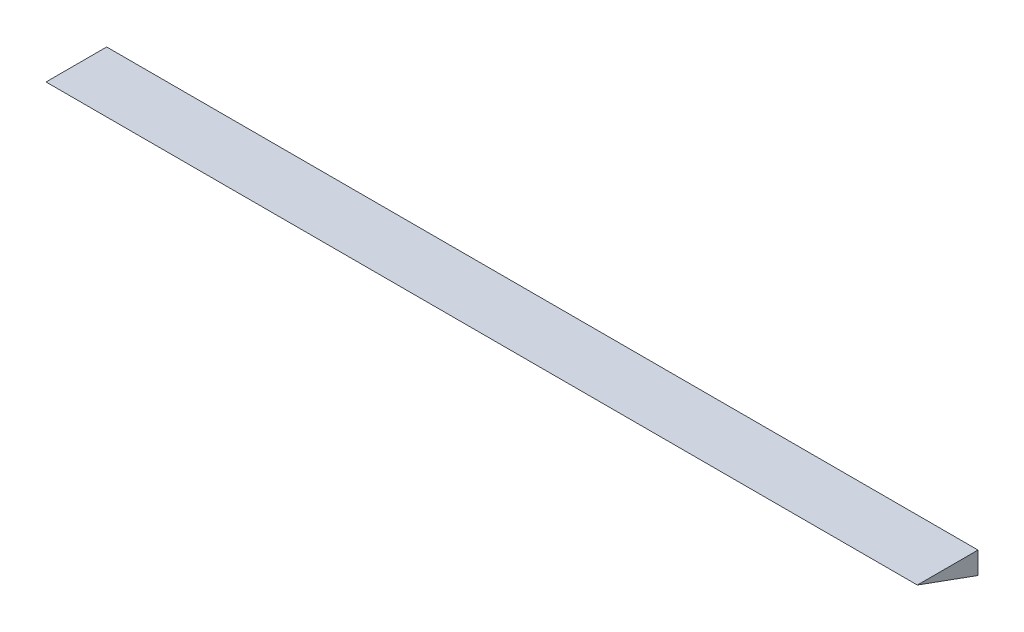
ISO-10303-21;
HEADER;
FILE_DESCRIPTION(('STEP AP214'),'2;1');
FILE_NAME('part.step','',(''),(''),'','','');
FILE_SCHEMA(('AUTOMOTIVE_DESIGN { 1 0 10303 214 1 1 1 1 }'));
ENDSEC;
DATA;
#1=APPLICATION_CONTEXT('core data for automotive mechanical design processes');
#2=APPLICATION_PROTOCOL_DEFINITION('international standard','automotive_design',2000,#1);
#3=PRODUCT_CONTEXT('',#1,'mechanical');
#4=PRODUCT('Part','Part','',(#3));
#5=PRODUCT_RELATED_PRODUCT_CATEGORY('part','',(#4));
#6=PRODUCT_DEFINITION_FORMATION('','',#4);
#7=PRODUCT_DEFINITION_CONTEXT('part definition',#1,'design');
#8=PRODUCT_DEFINITION('design','',#6,#7);
#9=PRODUCT_DEFINITION_SHAPE('','',#8);
#10=(LENGTH_UNIT() NAMED_UNIT(*) SI_UNIT(.MILLI.,.METRE.));
#11=(NAMED_UNIT(*) PLANE_ANGLE_UNIT() SI_UNIT($,.RADIAN.));
#12=(NAMED_UNIT(*) SI_UNIT($,.STERADIAN.) SOLID_ANGLE_UNIT());
#13=UNCERTAINTY_MEASURE_WITH_UNIT(LENGTH_MEASURE(1.E-05),#10,'distance_accuracy_value','');
#14=(GEOMETRIC_REPRESENTATION_CONTEXT(3) GLOBAL_UNCERTAINTY_ASSIGNED_CONTEXT((#13)) GLOBAL_UNIT_ASSIGNED_CONTEXT((#10,
#11,#12)) REPRESENTATION_CONTEXT('',''));
#15=CARTESIAN_POINT('',(0.,0.,0.));
#16=DIRECTION('',(0.,0.,1.));
#17=DIRECTION('',(1.,0.,0.));
#18=AXIS2_PLACEMENT_3D('',#15,#16,#17);
#19=CARTESIAN_POINT('',(108.,0.,0.));
#20=DIRECTION('',(0.,-1.,0.));
#21=DIRECTION('',(0.,0.,-1.));
#22=AXIS2_PLACEMENT_3D('',#19,#20,#21);
#23=PLANE('',#22);
#24=DIRECTION('',(0.,0.,1.));
#25=VECTOR('',#24,1.);
#26=CARTESIAN_POINT('',(0.,0.,0.));
#27=LINE('',#26,#25);
#28=CARTESIAN_POINT('',(0.,0.,-7.51754096628726));
#29=VERTEX_POINT('',#28);
#30=CARTESIAN_POINT('',(0.,0.,0.));
#31=VERTEX_POINT('',#30);
#32=EDGE_CURVE('E89',#29,#31,#27,.T.);
#33=ORIENTED_EDGE('',*,*,#32,.T.);
#34=DIRECTION('',(-1.,0.,0.));
#35=VECTOR('',#34,1.);
#36=CARTESIAN_POINT('',(108.,0.,0.));
#37=LINE('',#36,#35);
#38=CARTESIAN_POINT('',(108.,0.,0.));
#39=VERTEX_POINT('',#38);
#40=EDGE_CURVE('E11',#39,#31,#37,.T.);
#41=ORIENTED_EDGE('',*,*,#40,.F.);
#42=DIRECTION('',(0.,0.,1.));
#43=VECTOR('',#42,1.);
#44=CARTESIAN_POINT('',(108.,0.,0.));
#45=LINE('',#44,#43);
#46=CARTESIAN_POINT('',(108.,0.,-7.51754096628726));
#47=VERTEX_POINT('',#46);
#48=EDGE_CURVE('E81',#47,#39,#45,.T.);
#49=ORIENTED_EDGE('',*,*,#48,.F.);
#50=DIRECTION('',(-1.,0.,0.));
#51=VECTOR('',#50,1.);
#52=CARTESIAN_POINT('',(108.,0.,-7.51754096628726));
#53=LINE('',#52,#51);
#54=EDGE_CURVE('E90',#47,#29,#53,.T.);
#55=ORIENTED_EDGE('',*,*,#54,.T.);
#56=EDGE_LOOP('',(#33,#41,#49,#55));
#57=FACE_BOUND('',#56,.T.);
#58=ADVANCED_FACE('F39',(#57),#23,.F.);
#59=CARTESIAN_POINT('',(108.,0.,0.));
#60=DIRECTION('',(0.,0.939692620785908,-0.342020143325669));
#61=DIRECTION('',(0.,0.342020143325669,0.939692620785908));
#62=AXIS2_PLACEMENT_3D('',#59,#60,#61);
#63=PLANE('',#62);
#64=DIRECTION('',(0.,-0.342020143325669,-0.939692620785908));
#65=VECTOR('',#64,1.);
#66=CARTESIAN_POINT('',(0.,0.,0.));
#67=LINE('',#66,#65);
#68=CARTESIAN_POINT('',(0.,-2.73616114660536,-7.51754096628726));
#69=VERTEX_POINT('',#68);
#70=EDGE_CURVE('E68',#31,#69,#67,.T.);
#71=ORIENTED_EDGE('',*,*,#70,.T.);
#72=DIRECTION('',(-1.,0.,0.));
#73=VECTOR('',#72,1.);
#74=CARTESIAN_POINT('',(108.,-2.73616114660536,-7.51754096628726));
#75=LINE('',#74,#73);
#76=CARTESIAN_POINT('',(108.,-2.73616114660536,-7.51754096628726));
#77=VERTEX_POINT('',#76);
#78=EDGE_CURVE('E48',#77,#69,#75,.T.);
#79=ORIENTED_EDGE('',*,*,#78,.F.);
#80=DIRECTION('',(0.,-0.342020143325669,-0.939692620785908));
#81=VECTOR('',#80,1.);
#82=CARTESIAN_POINT('',(108.,0.,0.));
#83=LINE('',#82,#81);
#84=EDGE_CURVE('E76',#39,#77,#83,.T.);
#85=ORIENTED_EDGE('',*,*,#84,.F.);
#86=ORIENTED_EDGE('',*,*,#40,.T.);
#87=EDGE_LOOP('',(#71,#79,#85,#86));
#88=FACE_BOUND('',#87,.T.);
#89=ADVANCED_FACE('F77',(#88),#63,.F.);
#90=CARTESIAN_POINT('',(108.,0.,-7.51754096628726));
#91=DIRECTION('',(0.,0.,1.));
#92=DIRECTION('',(1.,0.,0.));
#93=AXIS2_PLACEMENT_3D('',#90,#91,#92);
#94=PLANE('',#93);
#95=DIRECTION('',(0.,1.,0.));
#96=VECTOR('',#95,1.);
#97=CARTESIAN_POINT('',(0.,0.,-7.51754096628726));
#98=LINE('',#97,#96);
#99=EDGE_CURVE('E73',#69,#29,#98,.T.);
#100=ORIENTED_EDGE('',*,*,#99,.T.);
#101=ORIENTED_EDGE('',*,*,#54,.F.);
#102=DIRECTION('',(0.,1.,0.));
#103=VECTOR('',#102,1.);
#104=CARTESIAN_POINT('',(108.,0.,-7.51754096628726));
#105=LINE('',#104,#103);
#106=EDGE_CURVE('E56',#77,#47,#105,.T.);
#107=ORIENTED_EDGE('',*,*,#106,.F.);
#108=ORIENTED_EDGE('',*,*,#78,.T.);
#109=EDGE_LOOP('',(#100,#101,#107,#108));
#110=FACE_BOUND('',#109,.T.);
#111=ADVANCED_FACE('F102',(#110),#94,.F.);
#112=CARTESIAN_POINT('',(108.,0.,0.));
#113=DIRECTION('',(-1.,0.,0.));
#114=DIRECTION('',(0.,0.,1.));
#115=AXIS2_PLACEMENT_3D('',#112,#113,#114);
#116=PLANE('',#115);
#117=ORIENTED_EDGE('',*,*,#48,.T.);
#118=ORIENTED_EDGE('',*,*,#84,.T.);
#119=ORIENTED_EDGE('',*,*,#106,.T.);
#120=EDGE_LOOP('',(#117,#118,#119));
#121=FACE_BOUND('',#120,.T.);
#122=ADVANCED_FACE('F84',(#121),#116,.F.);
#123=CARTESIAN_POINT('',(0.,0.,0.));
#124=DIRECTION('',(-1.,0.,0.));
#125=DIRECTION('',(0.,0.,1.));
#126=AXIS2_PLACEMENT_3D('',#123,#124,#125);
#127=PLANE('',#126);
#128=ORIENTED_EDGE('',*,*,#32,.F.);
#129=ORIENTED_EDGE('',*,*,#99,.F.);
#130=ORIENTED_EDGE('',*,*,#70,.F.);
#131=EDGE_LOOP('',(#128,#129,#130));
#132=FACE_BOUND('',#131,.T.);
#133=ADVANCED_FACE('F103',(#132),#127,.T.);
#134=CLOSED_SHELL('',(#58,#89,#111,#122,#133));
#135=MANIFOLD_SOLID_BREP('B2',#134);
#136=ADVANCED_BREP_SHAPE_REPRESENTATION('',(#18,#135),#14);
#137=SHAPE_DEFINITION_REPRESENTATION(#9,#136);
ENDSEC;
END-ISO-10303-21;
